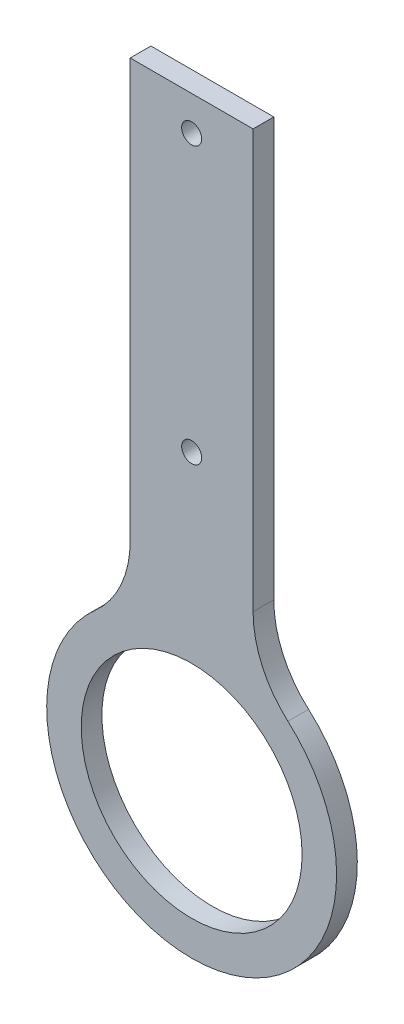
ISO-10303-21;
HEADER;
FILE_DESCRIPTION(('STEP AP214'),'2;1');
FILE_NAME('part.step','',(''),(''),'','','');
FILE_SCHEMA(('AUTOMOTIVE_DESIGN { 1 0 10303 214 1 1 1 1 }'));
ENDSEC;
DATA;
#1=APPLICATION_CONTEXT('core data for automotive mechanical design processes');
#2=APPLICATION_PROTOCOL_DEFINITION('international standard','automotive_design',2000,#1);
#3=PRODUCT_CONTEXT('',#1,'mechanical');
#4=PRODUCT('Part','Part','',(#3));
#5=PRODUCT_RELATED_PRODUCT_CATEGORY('part','',(#4));
#6=PRODUCT_DEFINITION_FORMATION('','',#4);
#7=PRODUCT_DEFINITION_CONTEXT('part definition',#1,'design');
#8=PRODUCT_DEFINITION('design','',#6,#7);
#9=PRODUCT_DEFINITION_SHAPE('','',#8);
#10=(LENGTH_UNIT() NAMED_UNIT(*) SI_UNIT(.MILLI.,.METRE.));
#11=(NAMED_UNIT(*) PLANE_ANGLE_UNIT() SI_UNIT($,.RADIAN.));
#12=(NAMED_UNIT(*) SI_UNIT($,.STERADIAN.) SOLID_ANGLE_UNIT());
#13=UNCERTAINTY_MEASURE_WITH_UNIT(LENGTH_MEASURE(1.E-05),#10,'distance_accuracy_value','');
#14=(GEOMETRIC_REPRESENTATION_CONTEXT(3) GLOBAL_UNCERTAINTY_ASSIGNED_CONTEXT((#13)) GLOBAL_UNIT_ASSIGNED_CONTEXT((#10,
#11,#12)) REPRESENTATION_CONTEXT('',''));
#15=CARTESIAN_POINT('',(0.,0.,0.));
#16=DIRECTION('',(0.,0.,1.));
#17=DIRECTION('',(1.,0.,0.));
#18=AXIS2_PLACEMENT_3D('',#15,#16,#17);
#19=CARTESIAN_POINT('',(0.,0.,-3.));
#20=DIRECTION('',(0.,0.,1.));
#21=DIRECTION('',(-1.,0.,0.));
#22=AXIS2_PLACEMENT_3D('',#19,#20,#21);
#23=CYLINDRICAL_SURFACE('',#22,21.);
#24=CARTESIAN_POINT('',(0.,0.,-3.));
#25=DIRECTION('',(0.,0.,1.));
#26=DIRECTION('',(1.,0.,0.));
#27=AXIS2_PLACEMENT_3D('',#24,#25,#26);
#28=CIRCLE('',#27,21.);
#29=CARTESIAN_POINT('',(-13.9416666666667,15.7044557548345,-3.));
#30=VERTEX_POINT('',#29);
#31=CARTESIAN_POINT('',(13.9416666666667,15.7044557548345,-3.));
#32=VERTEX_POINT('',#31);
#33=EDGE_CURVE('E133',#30,#32,#28,.T.);
#34=ORIENTED_EDGE('',*,*,#33,.T.);
#35=DIRECTION('',(0.,0.,1.));
#36=VECTOR('',#35,1.);
#37=CARTESIAN_POINT('',(13.9416666666667,15.7044557548345,-3.));
#38=LINE('',#37,#36);
#39=CARTESIAN_POINT('',(13.9416666666667,15.7044557548345,0.));
#40=VERTEX_POINT('',#39);
#41=EDGE_CURVE('E140',#40,#32,#38,.F.);
#42=ORIENTED_EDGE('',*,*,#41,.F.);
#43=CARTESIAN_POINT('',(0.,0.,0.));
#44=DIRECTION('',(0.,0.,1.));
#45=DIRECTION('',(1.,0.,0.));
#46=AXIS2_PLACEMENT_3D('',#43,#44,#45);
#47=CIRCLE('',#46,21.);
#48=CARTESIAN_POINT('',(-13.9416666666667,15.7044557548345,0.));
#49=VERTEX_POINT('',#48);
#50=EDGE_CURVE('E130',#49,#40,#47,.T.);
#51=ORIENTED_EDGE('',*,*,#50,.F.);
#52=DIRECTION('',(0.,0.,1.));
#53=VECTOR('',#52,1.);
#54=CARTESIAN_POINT('',(-13.9416666666667,15.7044557548345,-3.));
#55=LINE('',#54,#53);
#56=EDGE_CURVE('E143',#30,#49,#55,.T.);
#57=ORIENTED_EDGE('',*,*,#56,.F.);
#58=EDGE_LOOP('',(#34,#42,#51,#57));
#59=FACE_BOUND('',#58,.T.);
#60=ADVANCED_FACE('F43',(#59),#23,.T.);
#61=CARTESIAN_POINT('',(0.,0.,-3.));
#62=DIRECTION('',(0.,0.,1.));
#63=DIRECTION('',(-1.,0.,0.));
#64=AXIS2_PLACEMENT_3D('',#61,#62,#63);
#65=CYLINDRICAL_SURFACE('',#64,16.);
#66=CARTESIAN_POINT('',(0.,0.,0.));
#67=DIRECTION('',(0.,0.,1.));
#68=DIRECTION('',(1.,0.,0.));
#69=AXIS2_PLACEMENT_3D('',#66,#67,#68);
#70=CIRCLE('',#69,16.);
#71=CARTESIAN_POINT('',(16.,0.,0.));
#72=VERTEX_POINT('',#71);
#73=EDGE_CURVE('E102',#72,#72,#70,.T.);
#74=ORIENTED_EDGE('',*,*,#73,.T.);
#75=EDGE_LOOP('',(#74));
#76=FACE_BOUND('',#75,.T.);
#77=CARTESIAN_POINT('',(0.,0.,-3.));
#78=DIRECTION('',(0.,0.,1.));
#79=DIRECTION('',(1.,0.,0.));
#80=AXIS2_PLACEMENT_3D('',#77,#78,#79);
#81=CIRCLE('',#80,16.);
#82=CARTESIAN_POINT('',(16.,0.,-3.));
#83=VERTEX_POINT('',#82);
#84=EDGE_CURVE('E127',#83,#83,#81,.T.);
#85=ORIENTED_EDGE('',*,*,#84,.F.);
#86=EDGE_LOOP('',(#85));
#87=FACE_BOUND('',#86,.T.);
#88=ADVANCED_FACE('F175',(#76,#87),#65,.F.);
#89=CARTESIAN_POINT('',(0.,0.,-3.));
#90=DIRECTION('',(0.,0.,-1.));
#91=DIRECTION('',(1.,0.,0.));
#92=AXIS2_PLACEMENT_3D('',#89,#90,#91);
#93=PLANE('',#92);
#94=ORIENTED_EDGE('',*,*,#84,.T.);
#95=EDGE_LOOP('',(#94));
#96=FACE_BOUND('',#95,.T.);
#97=DIRECTION('',(0.,-1.,0.));
#98=VECTOR('',#97,1.);
#99=CARTESIAN_POINT('',(-8.9,12.5,-3.));
#100=LINE('',#99,#98);
#101=CARTESIAN_POINT('',(-8.9,87.5,-3.));
#102=VERTEX_POINT('',#101);
#103=CARTESIAN_POINT('',(-8.9,26.9219241511449,-3.));
#104=VERTEX_POINT('',#103);
#105=EDGE_CURVE('E115',#102,#104,#100,.T.);
#106=ORIENTED_EDGE('',*,*,#105,.F.);
#107=DIRECTION('',(-1.,0.,0.));
#108=VECTOR('',#107,1.);
#109=CARTESIAN_POINT('',(-8.9,87.5,-3.));
#110=LINE('',#109,#108);
#111=CARTESIAN_POINT('',(8.9,87.5,-3.));
#112=VERTEX_POINT('',#111);
#113=EDGE_CURVE('E97',#112,#102,#110,.T.);
#114=ORIENTED_EDGE('',*,*,#113,.F.);
#115=DIRECTION('',(0.,1.,0.));
#116=VECTOR('',#115,1.);
#117=CARTESIAN_POINT('',(8.9,12.5,-3.));
#118=LINE('',#117,#116);
#119=CARTESIAN_POINT('',(8.9,26.9219241511449,-3.));
#120=VERTEX_POINT('',#119);
#121=EDGE_CURVE('E106',#120,#112,#118,.T.);
#122=ORIENTED_EDGE('',*,*,#121,.F.);
#123=CARTESIAN_POINT('',(23.9,26.9219241511449,-3.));
#124=DIRECTION('',(0.,0.,1.));
#125=DIRECTION('',(1.,0.,0.));
#126=AXIS2_PLACEMENT_3D('',#123,#124,#125);
#127=CIRCLE('',#126,15.);
#128=EDGE_CURVE('E11',#32,#120,#127,.F.);
#129=ORIENTED_EDGE('',*,*,#128,.F.);
#130=ORIENTED_EDGE('',*,*,#33,.F.);
#131=CARTESIAN_POINT('',(-23.9,26.9219241511449,-3.));
#132=DIRECTION('',(0.,0.,1.));
#133=DIRECTION('',(1.,0.,0.));
#134=AXIS2_PLACEMENT_3D('',#131,#132,#133);
#135=CIRCLE('',#134,15.);
#136=EDGE_CURVE('E147',#104,#30,#135,.F.);
#137=ORIENTED_EDGE('',*,*,#136,.F.);
#138=EDGE_LOOP('',(#106,#114,#122,#129,#130,#137));
#139=FACE_BOUND('',#138,.T.);
#140=CARTESIAN_POINT('',(0.,42.5,-3.));
#141=DIRECTION('',(0.,0.,1.));
#142=DIRECTION('',(1.,0.,0.));
#143=AXIS2_PLACEMENT_3D('',#140,#141,#142);
#144=CIRCLE('',#143,1.45);
#145=CARTESIAN_POINT('',(1.45,42.5,-3.));
#146=VERTEX_POINT('',#145);
#147=EDGE_CURVE('E122',#146,#146,#144,.T.);
#148=ORIENTED_EDGE('',*,*,#147,.T.);
#149=EDGE_LOOP('',(#148));
#150=FACE_BOUND('',#149,.T.);
#151=CARTESIAN_POINT('',(0.,82.5,-3.));
#152=DIRECTION('',(0.,0.,1.));
#153=DIRECTION('',(1.,0.,0.));
#154=AXIS2_PLACEMENT_3D('',#151,#152,#153);
#155=CIRCLE('',#154,1.45);
#156=CARTESIAN_POINT('',(1.45,82.5,-3.));
#157=VERTEX_POINT('',#156);
#158=EDGE_CURVE('E204',#157,#157,#155,.T.);
#159=ORIENTED_EDGE('',*,*,#158,.T.);
#160=EDGE_LOOP('',(#159));
#161=FACE_BOUND('',#160,.T.);
#162=ADVANCED_FACE('F111',(#96,#139,#150,#161),#93,.T.);
#163=CARTESIAN_POINT('',(0.,0.,0.));
#164=DIRECTION('',(0.,0.,-1.));
#165=DIRECTION('',(1.,0.,0.));
#166=AXIS2_PLACEMENT_3D('',#163,#164,#165);
#167=PLANE('',#166);
#168=ORIENTED_EDGE('',*,*,#73,.F.);
#169=EDGE_LOOP('',(#168));
#170=FACE_BOUND('',#169,.T.);
#171=DIRECTION('',(0.,1.,0.));
#172=VECTOR('',#171,1.);
#173=CARTESIAN_POINT('',(8.9,12.5,0.));
#174=LINE('',#173,#172);
#175=CARTESIAN_POINT('',(8.9,26.9219241511449,0.));
#176=VERTEX_POINT('',#175);
#177=CARTESIAN_POINT('',(8.9,87.5,0.));
#178=VERTEX_POINT('',#177);
#179=EDGE_CURVE('E120',#176,#178,#174,.T.);
#180=ORIENTED_EDGE('',*,*,#179,.T.);
#181=DIRECTION('',(-1.,0.,0.));
#182=VECTOR('',#181,1.);
#183=CARTESIAN_POINT('',(-8.9,87.5,0.));
#184=LINE('',#183,#182);
#185=CARTESIAN_POINT('',(-8.9,87.5,0.));
#186=VERTEX_POINT('',#185);
#187=EDGE_CURVE('E100',#178,#186,#184,.T.);
#188=ORIENTED_EDGE('',*,*,#187,.T.);
#189=DIRECTION('',(0.,-1.,0.));
#190=VECTOR('',#189,1.);
#191=CARTESIAN_POINT('',(-8.9,12.5,0.));
#192=LINE('',#191,#190);
#193=CARTESIAN_POINT('',(-8.9,26.9219241511449,0.));
#194=VERTEX_POINT('',#193);
#195=EDGE_CURVE('E109',#186,#194,#192,.T.);
#196=ORIENTED_EDGE('',*,*,#195,.T.);
#197=CARTESIAN_POINT('',(-23.9,26.9219241511449,0.));
#198=DIRECTION('',(0.,0.,1.));
#199=DIRECTION('',(1.,0.,0.));
#200=AXIS2_PLACEMENT_3D('',#197,#198,#199);
#201=CIRCLE('',#200,15.);
#202=EDGE_CURVE('E149',#49,#194,#201,.T.);
#203=ORIENTED_EDGE('',*,*,#202,.F.);
#204=ORIENTED_EDGE('',*,*,#50,.T.);
#205=CARTESIAN_POINT('',(23.9,26.9219241511449,0.));
#206=DIRECTION('',(0.,0.,1.));
#207=DIRECTION('',(1.,0.,0.));
#208=AXIS2_PLACEMENT_3D('',#205,#206,#207);
#209=CIRCLE('',#208,15.);
#210=EDGE_CURVE('E51',#176,#40,#209,.T.);
#211=ORIENTED_EDGE('',*,*,#210,.F.);
#212=EDGE_LOOP('',(#180,#188,#196,#203,#204,#211));
#213=FACE_BOUND('',#212,.T.);
#214=CARTESIAN_POINT('',(0.,42.5,0.));
#215=DIRECTION('',(0.,0.,1.));
#216=DIRECTION('',(1.,0.,0.));
#217=AXIS2_PLACEMENT_3D('',#214,#215,#216);
#218=CIRCLE('',#217,1.45);
#219=CARTESIAN_POINT('',(1.45,42.5,0.));
#220=VERTEX_POINT('',#219);
#221=EDGE_CURVE('E203',#220,#220,#218,.T.);
#222=ORIENTED_EDGE('',*,*,#221,.F.);
#223=EDGE_LOOP('',(#222));
#224=FACE_BOUND('',#223,.T.);
#225=CARTESIAN_POINT('',(0.,82.5,0.));
#226=DIRECTION('',(0.,0.,1.));
#227=DIRECTION('',(1.,0.,0.));
#228=AXIS2_PLACEMENT_3D('',#225,#226,#227);
#229=CIRCLE('',#228,1.45);
#230=CARTESIAN_POINT('',(1.45,82.5,0.));
#231=VERTEX_POINT('',#230);
#232=EDGE_CURVE('E207',#231,#231,#229,.T.);
#233=ORIENTED_EDGE('',*,*,#232,.F.);
#234=EDGE_LOOP('',(#233));
#235=FACE_BOUND('',#234,.T.);
#236=ADVANCED_FACE('F154',(#170,#213,#224,#235),#167,.F.);
#237=CARTESIAN_POINT('',(8.9,12.5,-3.));
#238=DIRECTION('',(-1.,0.,0.));
#239=DIRECTION('',(0.,0.,-1.));
#240=AXIS2_PLACEMENT_3D('',#237,#238,#239);
#241=PLANE('',#240);
#242=ORIENTED_EDGE('',*,*,#121,.T.);
#243=DIRECTION('',(0.,0.,1.));
#244=VECTOR('',#243,1.);
#245=CARTESIAN_POINT('',(8.9,87.5,-3.));
#246=LINE('',#245,#244);
#247=EDGE_CURVE('E94',#112,#178,#246,.T.);
#248=ORIENTED_EDGE('',*,*,#247,.T.);
#249=ORIENTED_EDGE('',*,*,#179,.F.);
#250=DIRECTION('',(0.,0.,-1.));
#251=VECTOR('',#250,1.);
#252=CARTESIAN_POINT('',(8.9,26.9219241511449,0.));
#253=LINE('',#252,#251);
#254=EDGE_CURVE('E57',#120,#176,#253,.F.);
#255=ORIENTED_EDGE('',*,*,#254,.F.);
#256=EDGE_LOOP('',(#242,#248,#249,#255));
#257=FACE_BOUND('',#256,.T.);
#258=ADVANCED_FACE('F107',(#257),#241,.F.);
#259=CARTESIAN_POINT('',(-8.9,12.5,-3.));
#260=DIRECTION('',(1.,0.,0.));
#261=DIRECTION('',(0.,0.,1.));
#262=AXIS2_PLACEMENT_3D('',#259,#260,#261);
#263=PLANE('',#262);
#264=ORIENTED_EDGE('',*,*,#195,.F.);
#265=DIRECTION('',(0.,0.,1.));
#266=VECTOR('',#265,1.);
#267=CARTESIAN_POINT('',(-8.9,87.5,-3.));
#268=LINE('',#267,#266);
#269=EDGE_CURVE('E103',#102,#186,#268,.T.);
#270=ORIENTED_EDGE('',*,*,#269,.F.);
#271=ORIENTED_EDGE('',*,*,#105,.T.);
#272=DIRECTION('',(0.,0.,-1.));
#273=VECTOR('',#272,1.);
#274=CARTESIAN_POINT('',(-8.9,26.9219241511449,-3.));
#275=LINE('',#274,#273);
#276=EDGE_CURVE('E136',#194,#104,#275,.T.);
#277=ORIENTED_EDGE('',*,*,#276,.F.);
#278=EDGE_LOOP('',(#264,#270,#271,#277));
#279=FACE_BOUND('',#278,.T.);
#280=ADVANCED_FACE('F162',(#279),#263,.F.);
#281=CARTESIAN_POINT('',(-8.9,87.5,-3.));
#282=DIRECTION('',(0.,-1.,0.));
#283=DIRECTION('',(0.,0.,1.));
#284=AXIS2_PLACEMENT_3D('',#281,#282,#283);
#285=PLANE('',#284);
#286=ORIENTED_EDGE('',*,*,#187,.F.);
#287=ORIENTED_EDGE('',*,*,#247,.F.);
#288=ORIENTED_EDGE('',*,*,#113,.T.);
#289=ORIENTED_EDGE('',*,*,#269,.T.);
#290=EDGE_LOOP('',(#286,#287,#288,#289));
#291=FACE_BOUND('',#290,.T.);
#292=ADVANCED_FACE('F95',(#291),#285,.F.);
#293=CARTESIAN_POINT('',(0.,42.5,-3.));
#294=DIRECTION('',(0.,0.,1.));
#295=DIRECTION('',(-1.,0.,0.));
#296=AXIS2_PLACEMENT_3D('',#293,#294,#295);
#297=CYLINDRICAL_SURFACE('',#296,1.45);
#298=ORIENTED_EDGE('',*,*,#147,.F.);
#299=EDGE_LOOP('',(#298));
#300=FACE_BOUND('',#299,.T.);
#301=ORIENTED_EDGE('',*,*,#221,.T.);
#302=EDGE_LOOP('',(#301));
#303=FACE_BOUND('',#302,.T.);
#304=ADVANCED_FACE('F170',(#300,#303),#297,.F.);
#305=CARTESIAN_POINT('',(0.,82.5,-3.));
#306=DIRECTION('',(0.,0.,1.));
#307=DIRECTION('',(-1.,0.,0.));
#308=AXIS2_PLACEMENT_3D('',#305,#306,#307);
#309=CYLINDRICAL_SURFACE('',#308,1.45);
#310=ORIENTED_EDGE('',*,*,#158,.F.);
#311=EDGE_LOOP('',(#310));
#312=FACE_BOUND('',#311,.T.);
#313=ORIENTED_EDGE('',*,*,#232,.T.);
#314=EDGE_LOOP('',(#313));
#315=FACE_BOUND('',#314,.T.);
#316=ADVANCED_FACE('F165',(#312,#315),#309,.F.);
#317=CARTESIAN_POINT('',(-23.9,26.9219241511449,-3.));
#318=DIRECTION('',(0.,0.,1.));
#319=DIRECTION('',(-1.,0.,0.));
#320=AXIS2_PLACEMENT_3D('',#317,#318,#319);
#321=CYLINDRICAL_SURFACE('',#320,15.);
#322=ORIENTED_EDGE('',*,*,#202,.T.);
#323=ORIENTED_EDGE('',*,*,#276,.T.);
#324=ORIENTED_EDGE('',*,*,#136,.T.);
#325=ORIENTED_EDGE('',*,*,#56,.T.);
#326=EDGE_LOOP('',(#322,#323,#324,#325));
#327=FACE_BOUND('',#326,.T.);
#328=ADVANCED_FACE('F163',(#327),#321,.F.);
#329=CARTESIAN_POINT('',(23.9,26.9219241511449,-3.));
#330=DIRECTION('',(0.,0.,1.));
#331=DIRECTION('',(-1.,0.,0.));
#332=AXIS2_PLACEMENT_3D('',#329,#330,#331);
#333=CYLINDRICAL_SURFACE('',#332,15.);
#334=ORIENTED_EDGE('',*,*,#128,.T.);
#335=ORIENTED_EDGE('',*,*,#254,.T.);
#336=ORIENTED_EDGE('',*,*,#210,.T.);
#337=ORIENTED_EDGE('',*,*,#41,.T.);
#338=EDGE_LOOP('',(#334,#335,#336,#337));
#339=FACE_BOUND('',#338,.T.);
#340=ADVANCED_FACE('F45',(#339),#333,.F.);
#341=CLOSED_SHELL('',(#60,#88,#162,#236,#258,#280,#292,#304,#316,#328,#340));
#342=MANIFOLD_SOLID_BREP('B2',#341);
#343=ADVANCED_BREP_SHAPE_REPRESENTATION('',(#18,#342),#14);
#344=SHAPE_DEFINITION_REPRESENTATION(#9,#343);
ENDSEC;
END-ISO-10303-21;
